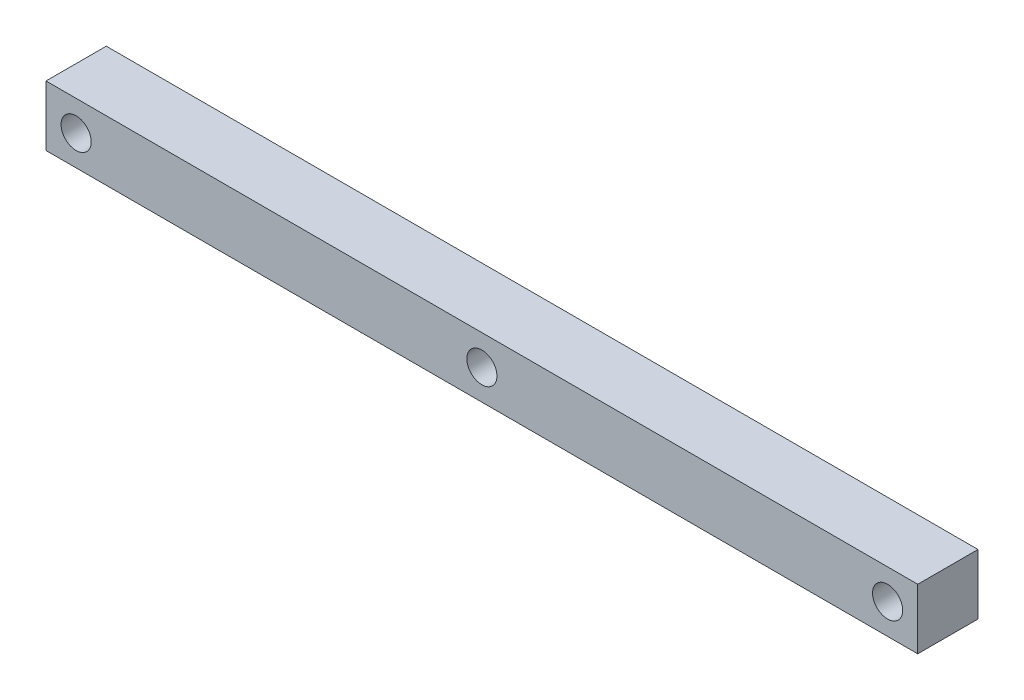
ISO-10303-21;
HEADER;
FILE_DESCRIPTION(('STEP AP214'),'2;1');
FILE_NAME('part.step','',(''),(''),'','','');
FILE_SCHEMA(('AUTOMOTIVE_DESIGN { 1 0 10303 214 1 1 1 1 }'));
ENDSEC;
DATA;
#1=APPLICATION_CONTEXT('core data for automotive mechanical design processes');
#2=APPLICATION_PROTOCOL_DEFINITION('international standard','automotive_design',2000,#1);
#3=PRODUCT_CONTEXT('',#1,'mechanical');
#4=PRODUCT('Part','Part','',(#3));
#5=PRODUCT_RELATED_PRODUCT_CATEGORY('part','',(#4));
#6=PRODUCT_DEFINITION_FORMATION('','',#4);
#7=PRODUCT_DEFINITION_CONTEXT('part definition',#1,'design');
#8=PRODUCT_DEFINITION('design','',#6,#7);
#9=PRODUCT_DEFINITION_SHAPE('','',#8);
#10=(LENGTH_UNIT() NAMED_UNIT(*) SI_UNIT(.MILLI.,.METRE.));
#11=(NAMED_UNIT(*) PLANE_ANGLE_UNIT() SI_UNIT($,.RADIAN.));
#12=(NAMED_UNIT(*) SI_UNIT($,.STERADIAN.) SOLID_ANGLE_UNIT());
#13=UNCERTAINTY_MEASURE_WITH_UNIT(LENGTH_MEASURE(1.E-05),#10,'distance_accuracy_value','');
#14=(GEOMETRIC_REPRESENTATION_CONTEXT(3) GLOBAL_UNCERTAINTY_ASSIGNED_CONTEXT((#13)) GLOBAL_UNIT_ASSIGNED_CONTEXT((#10,
#11,#12)) REPRESENTATION_CONTEXT('',''));
#15=CARTESIAN_POINT('',(0.,0.,0.));
#16=DIRECTION('',(0.,0.,1.));
#17=DIRECTION('',(1.,0.,0.));
#18=AXIS2_PLACEMENT_3D('',#15,#16,#17);
#19=CARTESIAN_POINT('',(0.,0.,15.));
#20=DIRECTION('',(0.,0.,-1.));
#21=DIRECTION('',(-1.,0.,0.));
#22=AXIS2_PLACEMENT_3D('',#19,#20,#21);
#23=PLANE('',#22);
#24=DIRECTION('',(0.,-1.,0.));
#25=VECTOR('',#24,1.);
#26=CARTESIAN_POINT('',(-217.,15.,15.));
#27=LINE('',#26,#25);
#28=CARTESIAN_POINT('',(-217.,15.,15.));
#29=VERTEX_POINT('',#28);
#30=CARTESIAN_POINT('',(-217.,-15.,15.));
#31=VERTEX_POINT('',#30);
#32=EDGE_CURVE('E104',#29,#31,#27,.T.);
#33=ORIENTED_EDGE('',*,*,#32,.T.);
#34=DIRECTION('',(1.,0.,0.));
#35=VECTOR('',#34,1.);
#36=CARTESIAN_POINT('',(217.,-15.,15.));
#37=LINE('',#36,#35);
#38=CARTESIAN_POINT('',(217.,-15.,15.));
#39=VERTEX_POINT('',#38);
#40=EDGE_CURVE('E99',#31,#39,#37,.T.);
#41=ORIENTED_EDGE('',*,*,#40,.T.);
#42=DIRECTION('',(0.,1.,0.));
#43=VECTOR('',#42,1.);
#44=CARTESIAN_POINT('',(217.,15.,15.));
#45=LINE('',#44,#43);
#46=CARTESIAN_POINT('',(217.,15.,15.));
#47=VERTEX_POINT('',#46);
#48=EDGE_CURVE('E102',#39,#47,#45,.T.);
#49=ORIENTED_EDGE('',*,*,#48,.T.);
#50=DIRECTION('',(-1.,0.,0.));
#51=VECTOR('',#50,1.);
#52=CARTESIAN_POINT('',(217.,15.,15.));
#53=LINE('',#52,#51);
#54=EDGE_CURVE('E64',#47,#29,#53,.T.);
#55=ORIENTED_EDGE('',*,*,#54,.T.);
#56=EDGE_LOOP('',(#33,#41,#49,#55));
#57=FACE_BOUND('',#56,.T.);
#58=CARTESIAN_POINT('',(202.,0.,15.));
#59=DIRECTION('',(0.,0.,1.));
#60=DIRECTION('',(1.,0.,0.));
#61=AXIS2_PLACEMENT_3D('',#58,#59,#60);
#62=CIRCLE('',#61,7.50000000000007);
#63=CARTESIAN_POINT('',(209.5,0.,15.));
#64=VERTEX_POINT('',#63);
#65=EDGE_CURVE('E125',#64,#64,#62,.T.);
#66=ORIENTED_EDGE('',*,*,#65,.F.);
#67=EDGE_LOOP('',(#66));
#68=FACE_BOUND('',#67,.T.);
#69=CARTESIAN_POINT('',(-202.,0.,15.));
#70=DIRECTION('',(0.,0.,1.));
#71=DIRECTION('',(1.,0.,0.));
#72=AXIS2_PLACEMENT_3D('',#69,#70,#71);
#73=CIRCLE('',#72,7.50000000000001);
#74=CARTESIAN_POINT('',(-194.5,0.,15.));
#75=VERTEX_POINT('',#74);
#76=EDGE_CURVE('E148',#75,#75,#73,.T.);
#77=ORIENTED_EDGE('',*,*,#76,.F.);
#78=EDGE_LOOP('',(#77));
#79=FACE_BOUND('',#78,.T.);
#80=CARTESIAN_POINT('',(0.,0.,15.));
#81=DIRECTION('',(0.,0.,1.));
#82=DIRECTION('',(1.,0.,0.));
#83=AXIS2_PLACEMENT_3D('',#80,#81,#82);
#84=CIRCLE('',#83,7.5);
#85=CARTESIAN_POINT('',(7.5,0.,15.));
#86=VERTEX_POINT('',#85);
#87=EDGE_CURVE('E155',#86,#86,#84,.T.);
#88=ORIENTED_EDGE('',*,*,#87,.F.);
#89=EDGE_LOOP('',(#88));
#90=FACE_BOUND('',#89,.T.);
#91=ADVANCED_FACE('F43',(#57,#68,#79,#90),#23,.F.);
#92=CARTESIAN_POINT('',(0.,0.,-15.));
#93=DIRECTION('',(0.,0.,-1.));
#94=DIRECTION('',(-1.,0.,0.));
#95=AXIS2_PLACEMENT_3D('',#92,#93,#94);
#96=PLANE('',#95);
#97=CARTESIAN_POINT('',(-202.,0.,-15.));
#98=DIRECTION('',(0.,0.,1.));
#99=DIRECTION('',(1.,0.,0.));
#100=AXIS2_PLACEMENT_3D('',#97,#98,#99);
#101=CIRCLE('',#100,7.50000000000001);
#102=CARTESIAN_POINT('',(-194.5,0.,-15.));
#103=VERTEX_POINT('',#102);
#104=EDGE_CURVE('E152',#103,#103,#101,.T.);
#105=ORIENTED_EDGE('',*,*,#104,.T.);
#106=EDGE_LOOP('',(#105));
#107=FACE_BOUND('',#106,.T.);
#108=DIRECTION('',(0.,-1.,0.));
#109=VECTOR('',#108,1.);
#110=CARTESIAN_POINT('',(-217.,15.,-15.));
#111=LINE('',#110,#109);
#112=CARTESIAN_POINT('',(-217.,15.,-15.));
#113=VERTEX_POINT('',#112);
#114=CARTESIAN_POINT('',(-217.,-15.,-15.));
#115=VERTEX_POINT('',#114);
#116=EDGE_CURVE('E121',#113,#115,#111,.T.);
#117=ORIENTED_EDGE('',*,*,#116,.F.);
#118=DIRECTION('',(-1.,0.,0.));
#119=VECTOR('',#118,1.);
#120=CARTESIAN_POINT('',(217.,15.,-15.));
#121=LINE('',#120,#119);
#122=CARTESIAN_POINT('',(217.,15.,-15.));
#123=VERTEX_POINT('',#122);
#124=EDGE_CURVE('E92',#123,#113,#121,.T.);
#125=ORIENTED_EDGE('',*,*,#124,.F.);
#126=DIRECTION('',(0.,1.,0.));
#127=VECTOR('',#126,1.);
#128=CARTESIAN_POINT('',(217.,15.,-15.));
#129=LINE('',#128,#127);
#130=CARTESIAN_POINT('',(217.,-15.,-15.));
#131=VERTEX_POINT('',#130);
#132=EDGE_CURVE('E86',#131,#123,#129,.T.);
#133=ORIENTED_EDGE('',*,*,#132,.F.);
#134=DIRECTION('',(1.,0.,0.));
#135=VECTOR('',#134,1.);
#136=CARTESIAN_POINT('',(217.,-15.,-15.));
#137=LINE('',#136,#135);
#138=EDGE_CURVE('E109',#115,#131,#137,.T.);
#139=ORIENTED_EDGE('',*,*,#138,.F.);
#140=EDGE_LOOP('',(#117,#125,#133,#139));
#141=FACE_BOUND('',#140,.T.);
#142=CARTESIAN_POINT('',(202.,0.,-15.));
#143=DIRECTION('',(0.,0.,1.));
#144=DIRECTION('',(1.,0.,0.));
#145=AXIS2_PLACEMENT_3D('',#142,#143,#144);
#146=CIRCLE('',#145,7.50000000000007);
#147=CARTESIAN_POINT('',(209.5,0.,-15.));
#148=VERTEX_POINT('',#147);
#149=EDGE_CURVE('E144',#148,#148,#146,.T.);
#150=ORIENTED_EDGE('',*,*,#149,.T.);
#151=EDGE_LOOP('',(#150));
#152=FACE_BOUND('',#151,.T.);
#153=CARTESIAN_POINT('',(0.,0.,-15.));
#154=DIRECTION('',(0.,0.,1.));
#155=DIRECTION('',(1.,0.,0.));
#156=AXIS2_PLACEMENT_3D('',#153,#154,#155);
#157=CIRCLE('',#156,7.5);
#158=CARTESIAN_POINT('',(7.5,0.,-15.));
#159=VERTEX_POINT('',#158);
#160=EDGE_CURVE('E158',#159,#159,#157,.T.);
#161=ORIENTED_EDGE('',*,*,#160,.T.);
#162=EDGE_LOOP('',(#161));
#163=FACE_BOUND('',#162,.T.);
#164=ADVANCED_FACE('F137',(#107,#141,#152,#163),#96,.T.);
#165=CARTESIAN_POINT('',(-217.,15.,15.));
#166=DIRECTION('',(1.,0.,0.));
#167=DIRECTION('',(0.,1.,0.));
#168=AXIS2_PLACEMENT_3D('',#165,#166,#167);
#169=PLANE('',#168);
#170=ORIENTED_EDGE('',*,*,#116,.T.);
#171=DIRECTION('',(0.,0.,-1.));
#172=VECTOR('',#171,1.);
#173=CARTESIAN_POINT('',(-217.,-15.,15.));
#174=LINE('',#173,#172);
#175=EDGE_CURVE('E11',#31,#115,#174,.T.);
#176=ORIENTED_EDGE('',*,*,#175,.F.);
#177=ORIENTED_EDGE('',*,*,#32,.F.);
#178=DIRECTION('',(0.,0.,-1.));
#179=VECTOR('',#178,1.);
#180=CARTESIAN_POINT('',(-217.,15.,15.));
#181=LINE('',#180,#179);
#182=EDGE_CURVE('E117',#29,#113,#181,.T.);
#183=ORIENTED_EDGE('',*,*,#182,.T.);
#184=EDGE_LOOP('',(#170,#176,#177,#183));
#185=FACE_BOUND('',#184,.T.);
#186=ADVANCED_FACE('F45',(#185),#169,.F.);
#187=CARTESIAN_POINT('',(217.,-15.,15.));
#188=DIRECTION('',(0.,1.,0.));
#189=DIRECTION('',(0.,0.,1.));
#190=AXIS2_PLACEMENT_3D('',#187,#188,#189);
#191=PLANE('',#190);
#192=ORIENTED_EDGE('',*,*,#138,.T.);
#193=DIRECTION('',(0.,0.,-1.));
#194=VECTOR('',#193,1.);
#195=CARTESIAN_POINT('',(217.,-15.,15.));
#196=LINE('',#195,#194);
#197=EDGE_CURVE('E53',#39,#131,#196,.T.);
#198=ORIENTED_EDGE('',*,*,#197,.F.);
#199=ORIENTED_EDGE('',*,*,#40,.F.);
#200=ORIENTED_EDGE('',*,*,#175,.T.);
#201=EDGE_LOOP('',(#192,#198,#199,#200));
#202=FACE_BOUND('',#201,.T.);
#203=ADVANCED_FACE('F108',(#202),#191,.F.);
#204=CARTESIAN_POINT('',(217.,15.,15.));
#205=DIRECTION('',(-1.,0.,0.));
#206=DIRECTION('',(0.,0.,1.));
#207=AXIS2_PLACEMENT_3D('',#204,#205,#206);
#208=PLANE('',#207);
#209=ORIENTED_EDGE('',*,*,#132,.T.);
#210=DIRECTION('',(0.,0.,-1.));
#211=VECTOR('',#210,1.);
#212=CARTESIAN_POINT('',(217.,15.,15.));
#213=LINE('',#212,#211);
#214=EDGE_CURVE('E111',#47,#123,#213,.T.);
#215=ORIENTED_EDGE('',*,*,#214,.F.);
#216=ORIENTED_EDGE('',*,*,#48,.F.);
#217=ORIENTED_EDGE('',*,*,#197,.T.);
#218=EDGE_LOOP('',(#209,#215,#216,#217));
#219=FACE_BOUND('',#218,.T.);
#220=ADVANCED_FACE('F112',(#219),#208,.F.);
#221=CARTESIAN_POINT('',(217.,15.,15.));
#222=DIRECTION('',(0.,-1.,0.));
#223=DIRECTION('',(0.,0.,-1.));
#224=AXIS2_PLACEMENT_3D('',#221,#222,#223);
#225=PLANE('',#224);
#226=ORIENTED_EDGE('',*,*,#124,.T.);
#227=ORIENTED_EDGE('',*,*,#182,.F.);
#228=ORIENTED_EDGE('',*,*,#54,.F.);
#229=ORIENTED_EDGE('',*,*,#214,.T.);
#230=EDGE_LOOP('',(#226,#227,#228,#229));
#231=FACE_BOUND('',#230,.T.);
#232=ADVANCED_FACE('F134',(#231),#225,.F.);
#233=CARTESIAN_POINT('',(202.,0.,15.));
#234=DIRECTION('',(0.,0.,-1.));
#235=DIRECTION('',(-1.,0.,0.));
#236=AXIS2_PLACEMENT_3D('',#233,#234,#235);
#237=CYLINDRICAL_SURFACE('',#236,7.50000000000007);
#238=ORIENTED_EDGE('',*,*,#65,.T.);
#239=EDGE_LOOP('',(#238));
#240=FACE_BOUND('',#239,.T.);
#241=ORIENTED_EDGE('',*,*,#149,.F.);
#242=EDGE_LOOP('',(#241));
#243=FACE_BOUND('',#242,.T.);
#244=ADVANCED_FACE('F177',(#240,#243),#237,.F.);
#245=CARTESIAN_POINT('',(-202.,0.,15.));
#246=DIRECTION('',(0.,0.,-1.));
#247=DIRECTION('',(-1.,0.,0.));
#248=AXIS2_PLACEMENT_3D('',#245,#246,#247);
#249=CYLINDRICAL_SURFACE('',#248,7.50000000000001);
#250=ORIENTED_EDGE('',*,*,#76,.T.);
#251=EDGE_LOOP('',(#250));
#252=FACE_BOUND('',#251,.T.);
#253=ORIENTED_EDGE('',*,*,#104,.F.);
#254=EDGE_LOOP('',(#253));
#255=FACE_BOUND('',#254,.T.);
#256=ADVANCED_FACE('F238',(#252,#255),#249,.F.);
#257=CARTESIAN_POINT('',(0.,0.,15.));
#258=DIRECTION('',(0.,0.,-1.));
#259=DIRECTION('',(-1.,0.,0.));
#260=AXIS2_PLACEMENT_3D('',#257,#258,#259);
#261=CYLINDRICAL_SURFACE('',#260,7.5);
#262=ORIENTED_EDGE('',*,*,#87,.T.);
#263=EDGE_LOOP('',(#262));
#264=FACE_BOUND('',#263,.T.);
#265=ORIENTED_EDGE('',*,*,#160,.F.);
#266=EDGE_LOOP('',(#265));
#267=FACE_BOUND('',#266,.T.);
#268=ADVANCED_FACE('F166',(#264,#267),#261,.F.);
#269=CLOSED_SHELL('',(#91,#164,#186,#203,#220,#232,#244,#256,#268));
#270=MANIFOLD_SOLID_BREP('B2',#269);
#271=ADVANCED_BREP_SHAPE_REPRESENTATION('',(#18,#270),#14);
#272=SHAPE_DEFINITION_REPRESENTATION(#9,#271);
ENDSEC;
END-ISO-10303-21;
